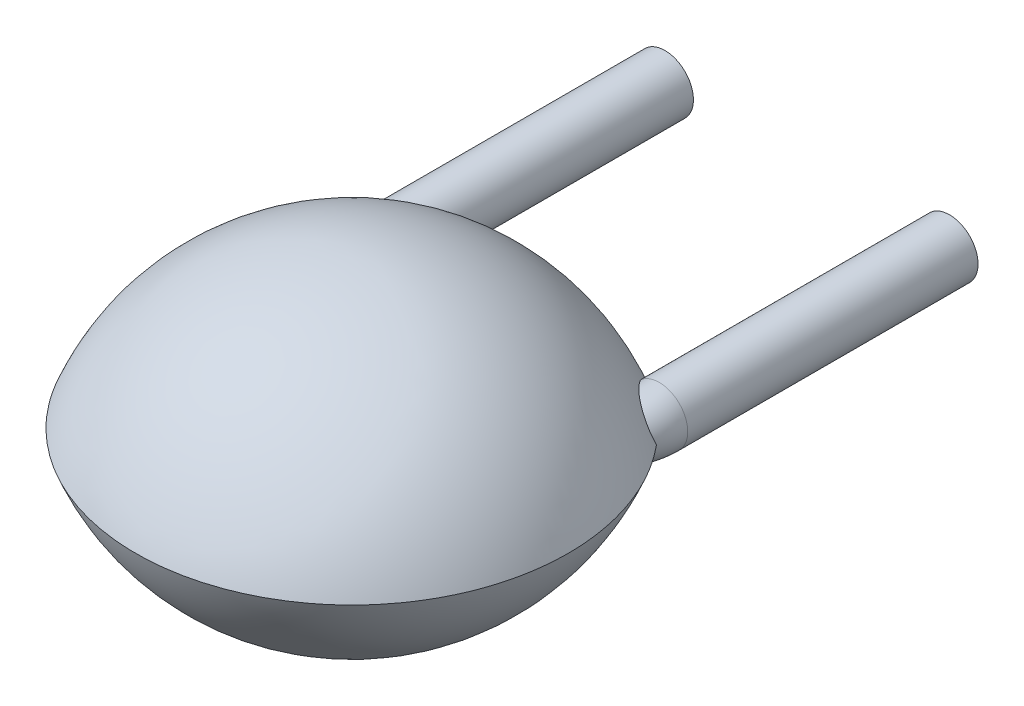
ISO-10303-21;
HEADER;
FILE_DESCRIPTION(('STEP AP214'),'2;1');
FILE_NAME('part.step','',(''),(''),'','','');
FILE_SCHEMA(('AUTOMOTIVE_DESIGN { 1 0 10303 214 1 1 1 1 }'));
ENDSEC;
DATA;
#1=APPLICATION_CONTEXT('core data for automotive mechanical design processes');
#2=APPLICATION_PROTOCOL_DEFINITION('international standard','automotive_design',2000,#1);
#3=PRODUCT_CONTEXT('',#1,'mechanical');
#4=PRODUCT('Part','Part','',(#3));
#5=PRODUCT_RELATED_PRODUCT_CATEGORY('part','',(#4));
#6=PRODUCT_DEFINITION_FORMATION('','',#4);
#7=PRODUCT_DEFINITION_CONTEXT('part definition',#1,'design');
#8=PRODUCT_DEFINITION('design','',#6,#7);
#9=PRODUCT_DEFINITION_SHAPE('','',#8);
#10=(LENGTH_UNIT() NAMED_UNIT(*) SI_UNIT(.MILLI.,.METRE.));
#11=(NAMED_UNIT(*) PLANE_ANGLE_UNIT() SI_UNIT($,.RADIAN.));
#12=(NAMED_UNIT(*) SI_UNIT($,.STERADIAN.) SOLID_ANGLE_UNIT());
#13=UNCERTAINTY_MEASURE_WITH_UNIT(LENGTH_MEASURE(1.E-05),#10,'distance_accuracy_value','');
#14=(GEOMETRIC_REPRESENTATION_CONTEXT(3) GLOBAL_UNCERTAINTY_ASSIGNED_CONTEXT((#13)) GLOBAL_UNIT_ASSIGNED_CONTEXT((#10,
#11,#12)) REPRESENTATION_CONTEXT('',''));
#15=CARTESIAN_POINT('',(0.,0.,0.));
#16=DIRECTION('',(0.,0.,1.));
#17=DIRECTION('',(1.,0.,0.));
#18=AXIS2_PLACEMENT_3D('',#15,#16,#17);
#19=CARTESIAN_POINT('',(2.5,0.25,-2.));
#20=DIRECTION('',(0.,0.,-1.));
#21=DIRECTION('',(-1.,0.,0.));
#22=AXIS2_PLACEMENT_3D('',#19,#20,#21);
#23=PLANE('',#22);
#24=CARTESIAN_POINT('',(2.5,0.,-2.));
#25=DIRECTION('',(0.,0.,-1.));
#26=DIRECTION('',(-1.,0.,0.));
#27=AXIS2_PLACEMENT_3D('',#24,#25,#26);
#28=CIRCLE('',#27,0.25);
#29=CARTESIAN_POINT('',(2.25,0.,-2.));
#30=VERTEX_POINT('',#29);
#31=EDGE_CURVE('E20',#30,#30,#28,.F.);
#32=ORIENTED_EDGE('',*,*,#31,.F.);
#33=EDGE_LOOP('',(#32));
#34=FACE_BOUND('',#33,.T.);
#35=ADVANCED_FACE('F17',(#34),#23,.T.);
#36=CARTESIAN_POINT('',(0.,-0.25,-2.));
#37=DIRECTION('',(0.,0.,-1.));
#38=DIRECTION('',(-1.,0.,0.));
#39=AXIS2_PLACEMENT_3D('',#36,#37,#38);
#40=PLANE('',#39);
#41=CARTESIAN_POINT('',(0.,0.,-2.));
#42=DIRECTION('',(0.,0.,-1.));
#43=DIRECTION('',(-1.,0.,0.));
#44=AXIS2_PLACEMENT_3D('',#41,#42,#43);
#45=CIRCLE('',#44,0.25);
#46=CARTESIAN_POINT('',(-0.25,0.,-2.));
#47=VERTEX_POINT('',#46);
#48=EDGE_CURVE('E70',#47,#47,#45,.F.);
#49=ORIENTED_EDGE('',*,*,#48,.F.);
#50=EDGE_LOOP('',(#49));
#51=FACE_BOUND('',#50,.T.);
#52=ADVANCED_FACE('F128',(#51),#40,.T.);
#53=CARTESIAN_POINT('',(2.,0.,0.55));
#54=DIRECTION('',(0.,1.,0.));
#55=DIRECTION('',(1.,0.,0.));
#56=AXIS2_PLACEMENT_3D('',#53,#54,#55);
#57=TOROIDAL_SURFACE('',#56,0.5,0.25);
#58=CARTESIAN_POINT('',(2.5,0.,0.55));
#59=DIRECTION('',(0.,0.,-1.));
#60=DIRECTION('',(-1.,0.,0.));
#61=AXIS2_PLACEMENT_3D('',#58,#59,#60);
#62=CIRCLE('',#61,0.25);
#63=CARTESIAN_POINT('',(2.33967642861984,0.19182375363836,0.549999999999892));
#64=VERTEX_POINT('',#63);
#65=CARTESIAN_POINT('',(2.33967642861984,-0.19182375363836,0.549999999999892));
#66=VERTEX_POINT('',#65);
#67=EDGE_CURVE('E120',#64,#66,#62,.T.);
#68=ORIENTED_EDGE('',*,*,#67,.F.);
#69=CARTESIAN_POINT('',(2.71180867908035,0.,0.786280351248031));
#70=CARTESIAN_POINT('',(2.71004264564576,0.0123026863462914,0.791636152737152));
#71=CARTESIAN_POINT('',(2.70744658000675,0.0247898076069364,0.796335896732494));
#72=CARTESIAN_POINT('',(2.70061747594,0.0498305443907029,0.804252049809482));
#73=CARTESIAN_POINT('',(2.69637925646758,0.0623842450770529,0.807463692750811));
#74=CARTESIAN_POINT('',(2.6862861744167,0.0872085822271726,0.812202758097146));
#75=CARTESIAN_POINT('',(2.68042672241234,0.0994783063330231,0.81372533683375));
#76=CARTESIAN_POINT('',(2.66723087520821,0.123273206458615,0.814934478372688));
#77=CARTESIAN_POINT('',(2.65989694932439,0.13479958529685,0.814624086532612));
#78=CARTESIAN_POINT('',(2.64444607849811,0.156033471912634,0.812192208369841));
#79=CARTESIAN_POINT('',(2.63640528130724,0.165809304620194,0.81018355618409));
#80=CARTESIAN_POINT('',(2.61942708937873,0.184039659455488,0.804529535741627));
#81=CARTESIAN_POINT('',(2.61048884850447,0.19249291504373,0.800882611405213));
#82=CARTESIAN_POINT('',(2.59250418693881,0.20738485363758,0.792304254471626));
#83=CARTESIAN_POINT('',(2.58348885229548,0.213906822429515,0.787451532296299));
#84=CARTESIAN_POINT('',(2.56516345268252,0.225367380238608,0.776541339102132));
#85=CARTESIAN_POINT('',(2.55585294507218,0.230303454411038,0.770481979050172));
#86=CARTESIAN_POINT('',(2.53703980936918,0.238584821221957,0.757266584188108));
#87=CARTESIAN_POINT('',(2.52753662934493,0.241901317980769,0.750093492217137));
#88=CARTESIAN_POINT('',(2.50871018553795,0.246846291433455,0.734972587265704));
#89=CARTESIAN_POINT('',(2.49938696501991,0.248474367048994,0.727024590699773));
#90=CARTESIAN_POINT('',(2.48521909221443,0.249776586253798,0.714313164474721));
#91=CARTESIAN_POINT('',(2.48025139990914,0.250000855507794,0.70973057346816));
#92=CARTESIAN_POINT('',(2.45992224260181,0.249997313669524,0.690491716931124));
#93=CARTESIAN_POINT('',(2.44506861187734,0.247774926857292,0.675264629136556));
#94=CARTESIAN_POINT('',(2.41666246880499,0.239813678720348,0.644395467550842));
#95=CARTESIAN_POINT('',(2.4031219480784,0.234045404066014,0.62875098084909));
#96=CARTESIAN_POINT('',(2.38122351002114,0.222131410609079,0.602452211335234));
#97=CARTESIAN_POINT('',(2.37255243183014,0.21664736801554,0.591742943971534));
#98=CARTESIAN_POINT('',(2.35576805639618,0.204817497034477,0.570650170765449));
#99=CARTESIAN_POINT('',(2.34764863131425,0.198484868065091,0.56026420179643));
#100=CARTESIAN_POINT('',(2.33967642861992,0.191823753638428,0.549999999999784));
#101=B_SPLINE_CURVE_WITH_KNOTS('',3,(#69,#70,#71,#72,#73,#74,#75,#76,#77,#78,#79,#80,#81,#82,
#83,#84,#85,#86,#87,#88,#89,#90,#91,#92,#93,#94,#95,#96,#97,#98,#99,#100),.UNSPECIFIED.,.F.,.F.,
(4,2,2,2,2,2,2,2,2,2,2,2,2,2,2,4),(0.,0.0405852617302961,0.0812996277628581,0.122130449501561,
0.162893452677065,0.201143406813637,0.23942976896728,0.275678085539534,0.31198360266027,
0.348913041574316,0.385851250934983,0.406126176789383,0.469790309892124,0.533989802801459,
0.578444914171931,0.622275047733233),.UNSPECIFIED.);
#102=CARTESIAN_POINT('',(2.71180867908034,0.,0.786280351248035));
#103=VERTEX_POINT('',#102);
#104=EDGE_CURVE('E133',#103,#64,#101,.T.);
#105=ORIENTED_EDGE('',*,*,#104,.F.);
#106=CARTESIAN_POINT('',(2.33967642861992,-0.191823753638428,0.549999999999785));
#107=CARTESIAN_POINT('',(2.35382024206758,-0.20366132720586,0.568205918656701));
#108=CARTESIAN_POINT('',(2.36857982936546,-0.214545670745477,0.58699741015042));
#109=CARTESIAN_POINT('',(2.40001275192986,-0.232840774920803,0.625203782500112));
#110=CARTESIAN_POINT('',(2.41671342701805,-0.240191844587071,0.644623832356187));
#111=CARTESIAN_POINT('',(2.44466468807502,-0.247391076121905,0.674697333045131));
#112=CARTESIAN_POINT('',(2.45518774990386,-0.249104002563269,0.685544676762089));
#113=CARTESIAN_POINT('',(2.47686103433331,-0.250357191997093,0.706708076457333));
#114=CARTESIAN_POINT('',(2.48801006032419,-0.249901469683349,0.717025078448846));
#115=CARTESIAN_POINT('',(2.51087996841043,-0.246519221970912,0.736847510490222));
#116=CARTESIAN_POINT('',(2.52260555871502,-0.243567289234642,0.746343484149907));
#117=CARTESIAN_POINT('',(2.54616798759702,-0.235002384157892,0.76392714374515));
#118=CARTESIAN_POINT('',(2.5580048365261,-0.229389161756135,0.772014697244447));
#119=CARTESIAN_POINT('',(2.5797932398648,-0.216471833064477,0.785398906054313));
#120=CARTESIAN_POINT('',(2.58979126030459,-0.209478614531371,0.790920856939063));
#121=CARTESIAN_POINT('',(2.60916505823208,-0.193716003210756,0.800325518305656));
#122=CARTESIAN_POINT('',(2.61854016104916,-0.184944724972887,0.804206475086649));
#123=CARTESIAN_POINT('',(2.63550840971512,-0.166812905003464,0.809908664256063));
#124=CARTESIAN_POINT('',(2.64318610748737,-0.157579506206919,0.811885739850419));
#125=CARTESIAN_POINT('',(2.65754299567974,-0.138183501983817,0.81434040554884));
#126=CARTESIAN_POINT('',(2.66422205712964,-0.128020776810816,0.814817802133873));
#127=CARTESIAN_POINT('',(2.67649722713142,-0.106942149145208,0.814304289192994));
#128=CARTESIAN_POINT('',(2.68207985453779,-0.0960188688703353,0.81329625899026));
#129=CARTESIAN_POINT('',(2.69196558676622,-0.0738161168722529,0.809867091278214));
#130=CARTESIAN_POINT('',(2.69626804756738,-0.0625364690147452,0.807445244320324));
#131=CARTESIAN_POINT('',(2.70265711510894,-0.0426470066391538,0.80205642054032));
#132=CARTESIAN_POINT('',(2.70502797063293,-0.0340512872542494,0.799362960166109));
#133=CARTESIAN_POINT('',(2.70899499683941,-0.0169441015213214,0.793307174192699));
#134=CARTESIAN_POINT('',(2.71059328108808,-0.00843246842858362,0.789946709340768));
#135=CARTESIAN_POINT('',(2.71180867908035,0.,0.786280351248031));
#136=B_SPLINE_CURVE_WITH_KNOTS('',3,(#106,#107,#108,#109,#110,#111,#112,#113,#114,#115,#116,
#117,#118,#119,#120,#121,#122,#123,#124,#125,#126,#127,#128,#129,#130,#131,#132,#133,#134,#135),
.UNSPECIFIED.,.F.,.F.,(4,2,2,2,2,2,2,2,2,2,2,2,2,2,4),(0.,0.0782332617051182,0.157745397379697,
0.203218557760381,0.248607569097597,0.29446420551576,0.340325151589702,0.380279475421244,
0.420276390457425,0.456617417012662,0.49296313283234,0.529731050737253,0.566517434540359,
0.594406613185225,0.622219055853219),.UNSPECIFIED.);
#137=EDGE_CURVE('E73',#66,#103,#136,.T.);
#138=ORIENTED_EDGE('',*,*,#137,.F.);
#139=EDGE_LOOP('',(#68,#105,#138));
#140=FACE_BOUND('',#139,.T.);
#141=ADVANCED_FACE('F124',(#140),#57,.T.);
#142=CARTESIAN_POINT('',(2.5,0.,-2.));
#143=DIRECTION('',(0.,0.,-1.));
#144=DIRECTION('',(-1.,0.,0.));
#145=AXIS2_PLACEMENT_3D('',#142,#143,#144);
#146=CYLINDRICAL_SURFACE('',#145,0.25);
#147=ORIENTED_EDGE('',*,*,#67,.T.);
#148=CARTESIAN_POINT('',(2.25,-1.58618777834629E-13,0.38445055785935));
#149=CARTESIAN_POINT('',(2.25000802876262,-0.0152176959885606,0.39141023330229));
#150=CARTESIAN_POINT('',(2.25138595607865,-0.0299280653334594,0.399247474992216));
#151=CARTESIAN_POINT('',(2.25640781320826,-0.0580095932672466,0.416215371049971));
#152=CARTESIAN_POINT('',(2.2600323513679,-0.0713910871048281,0.425334445802262));
#153=CARTESIAN_POINT('',(2.27032132981111,-0.100206891569967,0.447148218516795));
#154=CARTESIAN_POINT('',(2.27754454789407,-0.11520914925773,0.460140713620279));
#155=CARTESIAN_POINT('',(2.29422286277117,-0.142893267422686,0.487193547595633));
#156=CARTESIAN_POINT('',(2.3036861740974,-0.1555662751261,0.501257684357092));
#157=CARTESIAN_POINT('',(2.32207863554449,-0.176035911933796,0.52692768867748));
#158=CARTESIAN_POINT('',(2.33067722452864,-0.18429380583052,0.538403860602629));
#159=CARTESIAN_POINT('',(2.33967642861957,-0.19182375363885,0.549999999999789));
#160=B_SPLINE_CURVE_WITH_KNOTS('',3,(#148,#149,#150,#151,#152,#153,#154,#155,#156,#157,#158,
#159),.UNSPECIFIED.,.F.,.F.,(4,2,2,2,2,4),(0.,0.0499749752002792,0.0995244847395075,
0.162555277418786,0.225820889045544,0.275342710922731),.UNSPECIFIED.);
#161=CARTESIAN_POINT('',(2.25000000000016,0.,0.384450557859414));
#162=VERTEX_POINT('',#161);
#163=EDGE_CURVE('E121',#162,#66,#160,.T.);
#164=ORIENTED_EDGE('',*,*,#163,.F.);
#165=CARTESIAN_POINT('',(2.33967642861992,0.191823753638428,0.549999999999784));
#166=CARTESIAN_POINT('',(2.32825574870953,0.182264875775429,0.535278826173326));
#167=CARTESIAN_POINT('',(2.31746602220855,0.171520725403514,0.520737084196725));
#168=CARTESIAN_POINT('',(2.29755392575067,0.147525430850317,0.492209705735308));
#169=CARTESIAN_POINT('',(2.28845490129912,0.134243687307231,0.478233682572462));
#170=CARTESIAN_POINT('',(2.27419281031678,0.10810636659182,0.454046851222619));
#171=CARTESIAN_POINT('',(2.26860826203055,0.0956722401544215,0.443633092492513));
#172=CARTESIAN_POINT('',(2.25942218824158,0.0693876139720721,0.423909987732579));
#173=CARTESIAN_POINT('',(2.25580773793897,0.0555470702677371,0.414593765643413));
#174=CARTESIAN_POINT('',(2.25119943668037,0.0278781069501234,0.398159920716272));
#175=CARTESIAN_POINT('',(2.25000502151924,0.0141533072271886,0.390921554585737));
#176=CARTESIAN_POINT('',(2.25,1.59702980007115E-13,0.38445055785935));
#177=B_SPLINE_CURVE_WITH_KNOTS('',3,(#165,#166,#167,#168,#169,#170,#171,#172,#173,#174,#175,
#176),.UNSPECIFIED.,.F.,.F.,(4,2,2,2,2,4),(0.,0.0628930915862046,0.126598831996376,
0.177888456112784,0.228837416389597,0.275355611852808),.UNSPECIFIED.);
#178=EDGE_CURVE('E150',#64,#162,#177,.T.);
#179=ORIENTED_EDGE('',*,*,#178,.F.);
#180=EDGE_LOOP('',(#147,#164,#179));
#181=FACE_BOUND('',#180,.T.);
#182=ORIENTED_EDGE('',*,*,#31,.T.);
#183=EDGE_LOOP('',(#182));
#184=FACE_BOUND('',#183,.T.);
#185=ADVANCED_FACE('F127',(#181,#184),#146,.T.);
#186=CARTESIAN_POINT('',(1.25,0.738461538462,2.));
#187=DIRECTION('',(-1.,0.,0.));
#188=DIRECTION('',(0.,0.,-1.));
#189=AXIS2_PLACEMENT_3D('',#186,#187,#188);
#190=SPHERICAL_SURFACE('',#189,2.038461538462);
#191=CARTESIAN_POINT('',(-0.211808679080245,0.,0.786280351247921));
#192=CARTESIAN_POINT('',(-0.245948288275484,0.,0.827396694245884));
#193=CARTESIAN_POINT('',(-0.278336481491681,0.,0.869937856225508));
#194=CARTESIAN_POINT('',(-0.339412772625297,0.,0.957588993588415));
#195=CARTESIAN_POINT('',(-0.368101405707421,0.,1.00269859606661));
#196=CARTESIAN_POINT('',(-0.448279442701593,0.,1.1413792026529));
#197=CARTESIAN_POINT('',(-0.493954318120939,0.,1.23839052337636));
#198=CARTESIAN_POINT('',(-0.570363916786181,0.,1.44416186280976));
#199=CARTESIAN_POINT('',(-0.600156534652886,0.,1.55327356253875));
#200=CARTESIAN_POINT('',(-0.630016561729957,0.,1.71943564139133));
#201=CARTESIAN_POINT('',(-0.63749842684389,0.,1.77524408892699));
#202=CARTESIAN_POINT('',(-0.647493497856137,0.,1.88735980739971));
#203=CARTESIAN_POINT('',(-0.65000199423716,0.,1.94366750047476));
#204=CARTESIAN_POINT('',(-0.649996219934565,0.,2.10677796505443));
#205=CARTESIAN_POINT('',(-0.640972495912912,0.,2.21364505722566));
#206=CARTESIAN_POINT('',(-0.605089354086976,0.,2.42433661661069));
#207=CARTESIAN_POINT('',(-0.578231292129259,0.,2.52816131449452));
#208=CARTESIAN_POINT('',(-0.525201304185918,0.,2.6793568673995));
#209=CARTESIAN_POINT('',(-0.505382242028597,0.,2.72903207772008));
#210=CARTESIAN_POINT('',(-0.461654968755895,0.,2.82649130052237));
#211=CARTESIAN_POINT('',(-0.437750635445645,0.,2.87427705402182));
#212=CARTESIAN_POINT('',(-0.360099193184875,0.,3.01437695197656));
#213=CARTESIAN_POINT('',(-0.30039720086397,0.,3.10348046163067));
#214=CARTESIAN_POINT('',(-0.166910346644025,0.,3.27035312959801));
#215=CARTESIAN_POINT('',(-0.0931253321977707,0.,3.34812216512019));
#216=CARTESIAN_POINT('',(0.0664630636765711,0.,3.4901832766138));
#217=CARTESIAN_POINT('',(0.152266678138764,0.,3.55447509120891));
#218=CARTESIAN_POINT('',(0.333447130278477,0.,3.66773705859958));
#219=CARTESIAN_POINT('',(0.428823908592694,0.,3.71670730639661));
#220=CARTESIAN_POINT('',(0.626445027460674,0.,3.79794091965453));
#221=CARTESIAN_POINT('',(0.728689320001759,0.,3.83020440190327));
#222=CARTESIAN_POINT('',(0.937143346497634,0.,3.87710794799746));
#223=CARTESIAN_POINT('',(1.04335308923442,0.,3.89174797281115));
#224=CARTESIAN_POINT('',(1.25672324862672,0.,3.90298924198008));
#225=CARTESIAN_POINT('',(1.36388366771629,0.,3.89959044013662));
#226=CARTESIAN_POINT('',(1.57611286351821,0.,3.87485032009613));
#227=CARTESIAN_POINT('',(1.68118164092119,0.,3.85350900782359));
#228=CARTESIAN_POINT('',(1.88624478764606,0.,3.7934898706518));
#229=CARTESIAN_POINT('',(1.98623916661241,0.,3.75481207870381));
#230=CARTESIAN_POINT('',(2.17831521427326,0.,3.6612175922855));
#231=CARTESIAN_POINT('',(2.27039688633417,0.,3.60630090472392));
#232=CARTESIAN_POINT('',(2.44403363426223,0.,3.48178871014489));
#233=CARTESIAN_POINT('',(2.52558868116399,0.,3.41219316273803));
#234=CARTESIAN_POINT('',(2.67585759860073,0.,3.2602940678316));
#235=CARTESIAN_POINT('',(2.74457148850109,0.,3.17799053949692));
#236=CARTESIAN_POINT('',(2.86720414455643,0.,3.00303041627536));
#237=CARTESIAN_POINT('',(2.92112290679654,0.,2.91037381864902));
#238=CARTESIAN_POINT('',(3.01264874492933,0.,2.71726626540388));
#239=CARTESIAN_POINT('',(3.05025550869454,0.,2.6168151606818));
#240=CARTESIAN_POINT('',(3.09359850823991,0.,2.4626087631412));
#241=CARTESIAN_POINT('',(3.10586937367777,0.,2.4106084303331));
#242=CARTESIAN_POINT('',(3.1260055153221,0.,2.30570840876465));
#243=CARTESIAN_POINT('',(3.13386653101348,0.,2.25280790096571));
#244=CARTESIAN_POINT('',(3.15069728592631,-1.09865948462884E-13,2.09346471749396));
#245=CARTESIAN_POINT('',(3.15295366121618,0.,1.98624134639141));
#246=CARTESIAN_POINT('',(3.13940807771462,0.,1.77294245560523));
#247=CARTESIAN_POINT('',(3.12360674398155,0.,1.66686689631897));
#248=CARTESIAN_POINT('',(3.08675226427357,0.,1.51090721014018));
#249=CARTESIAN_POINT('',(3.07225436284355,0.,1.45939657885582));
#250=CARTESIAN_POINT('',(3.03897798433288,0.,1.35780971849097));
#251=CARTESIAN_POINT('',(3.02020305247257,0.,1.30773233987249));
#252=CARTESIAN_POINT('',(2.97851820290197,0.,1.20938210265778));
#253=CARTESIAN_POINT('',(2.95561165198502,0.,1.16110781313099));
#254=CARTESIAN_POINT('',(2.90581929790026,0.,1.06666704039678));
#255=CARTESIAN_POINT('',(2.87893448321756,0.,1.02050003730669));
#256=CARTESIAN_POINT('',(2.82905697207333,0.,0.942592235535391));
#257=CARTESIAN_POINT('',(2.80693860548547,0.,0.910287844914186));
#258=CARTESIAN_POINT('',(2.76079116070233,0.,0.847161356748013));
#259=CARTESIAN_POINT('',(2.73676551998025,0.,0.816336746230825));
#260=CARTESIAN_POINT('',(2.71180867908024,0.,0.78628035124792));
#261=B_SPLINE_CURVE_WITH_KNOTS('',3,(#191,#192,#193,#194,#195,#196,#197,#198,#199,#200,#201,
#202,#203,#204,#205,#206,#207,#208,#209,#210,#211,#212,#213,#214,#215,#216,#217,#218,#219,#220,
#221,#222,#223,#224,#225,#226,#227,#228,#229,#230,#231,#232,#233,#234,#235,#236,#237,#238,#239,
#240,#241,#242,#243,#244,#245,#246,#247,#248,#249,#250,#251,#252,#253,#254,#255,#256,#257,#258,
#259,#260),.UNSPECIFIED.,.F.,.F.,(4,2,2,2,2,2,2,2,2,2,2,2,2,2,2,2,2,2,2,2,2,2,2,2,2,2,2,2,2,2,2,
2,2,2,4),(0.,0.160234112509491,0.320445020080847,0.640526441662799,0.977926867506798,
1.14665862609693,1.31555008857269,1.63568299285021,1.95579156197086,2.11607330914585,
2.27620375085514,2.59631791600041,2.91643554881726,3.23655938939999,3.55668124501356,
3.87680086280024,4.19692118957466,4.51704233620028,4.83716337712424,5.15728380960032,
5.47740410588322,5.79752528300035,6.11764597734778,6.43776675640039,6.75789366064216,
6.91801615106518,7.07829307634696,7.39841935338259,7.71853454974641,7.87891161844481,
8.03915623158344,8.19927084898144,8.35934574905873,8.47672758894715,8.59390247632845),.UNSPECIFIED.);
#262=CARTESIAN_POINT('',(-0.211808679080295,0.,0.786280351247976));
#263=VERTEX_POINT('',#262);
#264=EDGE_CURVE('E33',#263,#103,#261,.T.);
#265=ORIENTED_EDGE('',*,*,#264,.F.);
#266=CARTESIAN_POINT('',(-0.211808679080346,0.,0.786280351248031));
#267=CARTESIAN_POINT('',(-0.210042645645757,-0.012302686346291,0.791636152737152));
#268=CARTESIAN_POINT('',(-0.20744658000675,-0.0247898076069361,0.796335896732494));
#269=CARTESIAN_POINT('',(-0.200617475939996,-0.0498305443907025,0.804252049809482));
#270=CARTESIAN_POINT('',(-0.196379256467577,-0.0623842450770526,0.807463692750811));
#271=CARTESIAN_POINT('',(-0.186286174416698,-0.0872085822271723,0.812202758097145));
#272=CARTESIAN_POINT('',(-0.180426722412337,-0.0994783063330228,0.81372533683375));
#273=CARTESIAN_POINT('',(-0.16723087520821,-0.123273206458615,0.814934478372688));
#274=CARTESIAN_POINT('',(-0.159896949324387,-0.13479958529685,0.814624086532612));
#275=CARTESIAN_POINT('',(-0.144446078498107,-0.156033471912634,0.812192208369841));
#276=CARTESIAN_POINT('',(-0.13640528130724,-0.165809304620194,0.81018355618409));
#277=CARTESIAN_POINT('',(-0.119427089378729,-0.184039659455487,0.804529535741627));
#278=CARTESIAN_POINT('',(-0.11048884850447,-0.19249291504373,0.800882611405213));
#279=CARTESIAN_POINT('',(-0.0925041869388082,-0.207384853637579,0.792304254471626));
#280=CARTESIAN_POINT('',(-0.083488852295485,-0.213906822429514,0.787451532296299));
#281=CARTESIAN_POINT('',(-0.065163452682516,-0.225367380238607,0.776541339102132));
#282=CARTESIAN_POINT('',(-0.0558529450721774,-0.230303454411037,0.770481979050172));
#283=CARTESIAN_POINT('',(-0.0370398093691832,-0.238584821221957,0.757266584188108));
#284=CARTESIAN_POINT('',(-0.0275366293449268,-0.241901317980769,0.750093492217137));
#285=CARTESIAN_POINT('',(-0.0087101855379557,-0.246846291433455,0.734972587265705));
#286=CARTESIAN_POINT('',(0.00061303498008678,-0.248474367048994,0.727024590699774));
#287=CARTESIAN_POINT('',(0.0147809077855687,-0.249776586253799,0.714313164474723));
#288=CARTESIAN_POINT('',(0.0197486000908545,-0.250000855507795,0.709730573468162));
#289=CARTESIAN_POINT('',(0.0400777573981851,-0.249997313669525,0.690491716931127));
#290=CARTESIAN_POINT('',(0.0549313881226579,-0.247774926857293,0.675264629136558));
#291=CARTESIAN_POINT('',(0.0833375311950081,-0.239813678720349,0.644395467550844));
#292=CARTESIAN_POINT('',(0.0968780519215996,-0.234045404066015,0.628750980849093));
#293=CARTESIAN_POINT('',(0.11877648997886,-0.22213141060908,0.602452211335236));
#294=CARTESIAN_POINT('',(0.127447568169858,-0.216647368015541,0.591742943971536));
#295=CARTESIAN_POINT('',(0.144231943603822,-0.204817497034477,0.57065017076545));
#296=CARTESIAN_POINT('',(0.152351368685754,-0.198484868065091,0.560264201796431));
#297=CARTESIAN_POINT('',(0.160323571380081,-0.191823753638428,0.549999999999785));
#298=B_SPLINE_CURVE_WITH_KNOTS('',3,(#266,#267,#268,#269,#270,#271,#272,#273,#274,#275,#276,
#277,#278,#279,#280,#281,#282,#283,#284,#285,#286,#287,#288,#289,#290,#291,#292,#293,#294,#295,
#296,#297),.UNSPECIFIED.,.F.,.F.,(4,2,2,2,2,2,2,2,2,2,2,2,2,2,2,4),(0.,0.040585261730296,
0.0812996277628577,0.122130449501561,0.162893452677065,0.201143406813637,0.239429768967279,
0.275678085539533,0.311983602660269,0.348913041574315,0.385851250934981,0.406126176789378,
0.46979030989212,0.533989802801455,0.578444914171929,0.622275047733233),.UNSPECIFIED.);
#299=CARTESIAN_POINT('',(0.160323571380162,-0.19182375363836,0.549999999999892));
#300=VERTEX_POINT('',#299);
#301=EDGE_CURVE('E58',#263,#300,#298,.T.);
#302=ORIENTED_EDGE('',*,*,#301,.T.);
#303=CARTESIAN_POINT('',(0.25,-1.58727198051878E-13,0.38445055785935));
#304=CARTESIAN_POINT('',(0.249991971237379,-0.015217695988551,0.391410233302286));
#305=CARTESIAN_POINT('',(0.248614043921353,-0.0299280653334434,0.399247474992208));
#306=CARTESIAN_POINT('',(0.243592186791745,-0.0580095932672337,0.416215371049962));
#307=CARTESIAN_POINT('',(0.239967648632106,-0.0713910871048235,0.425334445802257));
#308=CARTESIAN_POINT('',(0.229678670188891,-0.100206891569969,0.447148218516797));
#309=CARTESIAN_POINT('',(0.222455452105918,-0.115209149257729,0.460140713620285));
#310=CARTESIAN_POINT('',(0.205777137228834,-0.1428932674227,0.487193547595639));
#311=CARTESIAN_POINT('',(0.196313825902622,-0.155566275126135,0.501257684357094));
#312=CARTESIAN_POINT('',(0.177921364455489,-0.17603591193377,0.526927688677478));
#313=CARTESIAN_POINT('',(0.169322775471295,-0.184293805830435,0.538403860602626));
#314=CARTESIAN_POINT('',(0.160323571380255,-0.191823753638639,0.549999999999789));
#315=B_SPLINE_CURVE_WITH_KNOTS('',3,(#303,#304,#305,#306,#307,#308,#309,#310,#311,#312,#313,
#314),.UNSPECIFIED.,.F.,.F.,(4,2,2,2,2,4),(0.,0.0499749752002539,0.0995244847395075,
0.162555277418802,0.225820889045545,0.275342710922717),.UNSPECIFIED.);
#316=CARTESIAN_POINT('',(0.25,0.,0.38445055785935));
#317=VERTEX_POINT('',#316);
#318=EDGE_CURVE('E61',#317,#300,#315,.T.);
#319=ORIENTED_EDGE('',*,*,#318,.F.);
#320=CARTESIAN_POINT('',(2.25000000000032,0.,0.384450557859477));
#321=CARTESIAN_POINT('',(2.20454179773248,0.,0.356313095999268));
#322=CARTESIAN_POINT('',(2.15791745150982,0.,0.330108314744805));
#323=CARTESIAN_POINT('',(2.06263015803876,0.,0.281718737510083));
#324=CARTESIAN_POINT('',(2.01396730555779,0.,0.259533754909539));
#325=CARTESIAN_POINT('',(1.86553987332227,0.,0.199311782853213));
#326=CARTESIAN_POINT('',(1.76316455465077,0.,0.167501628086509));
#327=CARTESIAN_POINT('',(1.55454156653149,0.,0.121520506990689));
#328=CARTESIAN_POINT('',(1.44829243898728,0.,0.107356254599027));
#329=CARTESIAN_POINT('',(1.23487959327624,0.,0.0970610493791601));
#330=CARTESIAN_POINT('',(1.1277156611612,0.,0.100934437192226));
#331=CARTESIAN_POINT('',(0.915513728817239,0.,0.126617998001708));
#332=CARTESIAN_POINT('',(0.810477126095175,0.,0.148439593608543));
#333=CARTESIAN_POINT('',(0.605649467270094,0.,0.209415636094816));
#334=CARTESIAN_POINT('',(0.505850712809125,0.,0.248543800322616));
#335=CARTESIAN_POINT('',(0.382750938145238,0.,0.309195702779585));
#336=CARTESIAN_POINT('',(0.355670983440868,0.,0.323362819003583));
#337=CARTESIAN_POINT('',(0.302269730585121,0.,0.352961865948454));
#338=CARTESIAN_POINT('',(0.27594725416408,0.,0.368391670740911));
#339=CARTESIAN_POINT('',(0.249999999999676,0.,0.384450557859477));
#340=B_SPLINE_CURVE_WITH_KNOTS('',3,(#320,#321,#322,#323,#324,#325,#326,#327,#328,#329,#330,
#331,#332,#333,#334,#335,#336,#337,#338,#339),.UNSPECIFIED.,.F.,.F.,(4,2,2,2,2,2,2,2,2,4),(0.,
0.160286844036194,0.320566244802875,0.640526764760078,0.960608986597006,1.280768238127,
1.6011314034254,1.92100971021481,2.01267219839498,2.10418341449968),.UNSPECIFIED.);
#341=EDGE_CURVE('E100',#162,#317,#340,.T.);
#342=ORIENTED_EDGE('',*,*,#341,.F.);
#343=ORIENTED_EDGE('',*,*,#163,.T.);
#344=ORIENTED_EDGE('',*,*,#137,.T.);
#345=EDGE_LOOP('',(#265,#302,#319,#342,#343,#344));
#346=FACE_BOUND('',#345,.T.);
#347=ADVANCED_FACE('F59',(#346),#190,.T.);
#348=CARTESIAN_POINT('',(0.,0.,-2.));
#349=DIRECTION('',(0.,0.,-1.));
#350=DIRECTION('',(-1.,0.,0.));
#351=AXIS2_PLACEMENT_3D('',#348,#349,#350);
#352=CYLINDRICAL_SURFACE('',#351,0.25);
#353=ORIENTED_EDGE('',*,*,#318,.T.);
#354=CARTESIAN_POINT('',(0.,0.,0.55));
#355=DIRECTION('',(0.,0.,1.));
#356=DIRECTION('',(0.,-1.,0.));
#357=AXIS2_PLACEMENT_3D('',#354,#355,#356);
#358=CIRCLE('',#357,0.25);
#359=CARTESIAN_POINT('',(0.160323571380162,0.19182375363836,0.549999999999892));
#360=VERTEX_POINT('',#359);
#361=EDGE_CURVE('E42',#300,#360,#358,.F.);
#362=ORIENTED_EDGE('',*,*,#361,.T.);
#363=CARTESIAN_POINT('',(0.25,1.59594559789866E-13,0.38445055785935));
#364=CARTESIAN_POINT('',(0.249991971237381,0.0152176959885616,0.39141023330229));
#365=CARTESIAN_POINT('',(0.248614043921352,0.0299280653334604,0.399247474992217));
#366=CARTESIAN_POINT('',(0.24359218679174,0.0580095932672477,0.416215371049972));
#367=CARTESIAN_POINT('',(0.239967648632101,0.0713910871048292,0.425334445802263));
#368=CARTESIAN_POINT('',(0.229678670188893,0.100206891569969,0.447148218516795));
#369=CARTESIAN_POINT('',(0.222455452105928,0.115209149257731,0.460140713620279));
#370=CARTESIAN_POINT('',(0.20577713722883,0.142893267422687,0.487193547595634));
#371=CARTESIAN_POINT('',(0.196313825902596,0.155566275126102,0.501257684357093));
#372=CARTESIAN_POINT('',(0.177921364455508,0.176035911933797,0.526927688677481));
#373=CARTESIAN_POINT('',(0.169322775471363,0.184293805830521,0.538403860602629));
#374=CARTESIAN_POINT('',(0.160323571380432,0.19182375363885,0.549999999999789));
#375=B_SPLINE_CURVE_WITH_KNOTS('',3,(#363,#364,#365,#366,#367,#368,#369,#370,#371,#372,#373,
#374),.UNSPECIFIED.,.F.,.F.,(4,2,2,2,2,4),(0.,0.0499749752002796,0.099524484739508,
0.162555277418787,0.225820889045545,0.275342710922729),.UNSPECIFIED.);
#376=EDGE_CURVE('E25',#317,#360,#375,.T.);
#377=ORIENTED_EDGE('',*,*,#376,.F.);
#378=EDGE_LOOP('',(#353,#362,#377));
#379=FACE_BOUND('',#378,.T.);
#380=ORIENTED_EDGE('',*,*,#48,.T.);
#381=EDGE_LOOP('',(#380));
#382=FACE_BOUND('',#381,.T.);
#383=ADVANCED_FACE('F67',(#379,#382),#352,.T.);
#384=CARTESIAN_POINT('',(0.5,0.,0.55));
#385=DIRECTION('',(0.,-1.,0.));
#386=DIRECTION('',(-1.,0.,0.));
#387=AXIS2_PLACEMENT_3D('',#384,#385,#386);
#388=TOROIDAL_SURFACE('',#387,0.5,0.25);
#389=CARTESIAN_POINT('',(0.160323571380081,0.191823753638428,0.549999999999785));
#390=CARTESIAN_POINT('',(0.146179757932422,0.203661327205861,0.568205918656701));
#391=CARTESIAN_POINT('',(0.13142017063454,0.214545670745477,0.58699741015042));
#392=CARTESIAN_POINT('',(0.099987248070137,0.232840774920802,0.625203782500112));
#393=CARTESIAN_POINT('',(0.0832865729819545,0.24019184458707,0.644623832356186));
#394=CARTESIAN_POINT('',(0.0553353119249851,0.247391076121904,0.674697333045131));
#395=CARTESIAN_POINT('',(0.0448122500961373,0.249104002563269,0.685544676762089));
#396=CARTESIAN_POINT('',(0.0231389656666897,0.250357191997093,0.706708076457333));
#397=CARTESIAN_POINT('',(0.0119899396758125,0.249901469683349,0.717025078448845));
#398=CARTESIAN_POINT('',(-0.0108799684104322,0.246519221970912,0.736847510490221));
#399=CARTESIAN_POINT('',(-0.0226055587150223,0.243567289234642,0.746343484149906));
#400=CARTESIAN_POINT('',(-0.0461679875970242,0.235002384157893,0.76392714374515));
#401=CARTESIAN_POINT('',(-0.0580048365261022,0.229389161756135,0.772014697244447));
#402=CARTESIAN_POINT('',(-0.0797932398647995,0.216471833064476,0.785398906054313));
#403=CARTESIAN_POINT('',(-0.0897912603045884,0.20947861453137,0.790920856939063));
#404=CARTESIAN_POINT('',(-0.109165058232077,0.193716003210756,0.800325518305656));
#405=CARTESIAN_POINT('',(-0.118540161049163,0.184944724972887,0.804206475086649));
#406=CARTESIAN_POINT('',(-0.135508409715118,0.166812905003464,0.809908664256063));
#407=CARTESIAN_POINT('',(-0.143186107487365,0.157579506206919,0.811885739850419));
#408=CARTESIAN_POINT('',(-0.157542995679741,0.138183501983817,0.81434040554884));
#409=CARTESIAN_POINT('',(-0.164222057129636,0.128020776810816,0.814817802133873));
#410=CARTESIAN_POINT('',(-0.176497227131424,0.106942149145208,0.814304289192994));
#411=CARTESIAN_POINT('',(-0.182079854537789,0.0960188688703355,0.813296258990259));
#412=CARTESIAN_POINT('',(-0.191965586766217,0.0738161168722533,0.809867091278213));
#413=CARTESIAN_POINT('',(-0.196268047567378,0.0625364690147456,0.807445244320324));
#414=CARTESIAN_POINT('',(-0.202657115108944,0.0426470066391543,0.80205642054032));
#415=CARTESIAN_POINT('',(-0.205027970632931,0.0340512872542498,0.799362960166109));
#416=CARTESIAN_POINT('',(-0.208994996839405,0.0169441015213216,0.793307174192699));
#417=CARTESIAN_POINT('',(-0.210593281088083,0.00843246842858381,0.789946709340769));
#418=CARTESIAN_POINT('',(-0.211808679080346,0.,0.786280351248032));
#419=B_SPLINE_CURVE_WITH_KNOTS('',3,(#389,#390,#391,#392,#393,#394,#395,#396,#397,#398,#399,
#400,#401,#402,#403,#404,#405,#406,#407,#408,#409,#410,#411,#412,#413,#414,#415,#416,#417,#418),
.UNSPECIFIED.,.F.,.F.,(4,2,2,2,2,2,2,2,2,2,2,2,2,2,4),(0.,0.0782332617051182,0.157745397379697,
0.203218557760381,0.248607569097597,0.29446420551576,0.340325151589701,0.380279475421244,
0.420276390457425,0.456617417012662,0.492963132832339,0.529731050737253,0.566517434540358,
0.594406613185225,0.622219055853218),.UNSPECIFIED.);
#420=EDGE_CURVE('E11',#360,#263,#419,.T.);
#421=ORIENTED_EDGE('',*,*,#420,.F.);
#422=ORIENTED_EDGE('',*,*,#361,.F.);
#423=ORIENTED_EDGE('',*,*,#301,.F.);
#424=EDGE_LOOP('',(#421,#422,#423));
#425=FACE_BOUND('',#424,.T.);
#426=ADVANCED_FACE('F64',(#425),#388,.T.);
#427=CARTESIAN_POINT('',(1.25,-0.738461538462,2.));
#428=DIRECTION('',(-1.,0.,0.));
#429=DIRECTION('',(0.,0.,-1.));
#430=AXIS2_PLACEMENT_3D('',#427,#428,#429);
#431=SPHERICAL_SURFACE('',#430,2.038461538462);
#432=ORIENTED_EDGE('',*,*,#420,.T.);
#433=ORIENTED_EDGE('',*,*,#264,.T.);
#434=ORIENTED_EDGE('',*,*,#104,.T.);
#435=ORIENTED_EDGE('',*,*,#178,.T.);
#436=ORIENTED_EDGE('',*,*,#341,.T.);
#437=ORIENTED_EDGE('',*,*,#376,.T.);
#438=EDGE_LOOP('',(#432,#433,#434,#435,#436,#437));
#439=FACE_BOUND('',#438,.T.);
#440=ADVANCED_FACE('F109',(#439),#431,.T.);
#441=CLOSED_SHELL('',(#35,#52,#141,#185,#347,#383,#426,#440));
#442=MANIFOLD_SOLID_BREP('B1',#441);
#443=ADVANCED_BREP_SHAPE_REPRESENTATION('',(#18,#442),#14);
#444=SHAPE_DEFINITION_REPRESENTATION(#9,#443);
ENDSEC;
END-ISO-10303-21;
